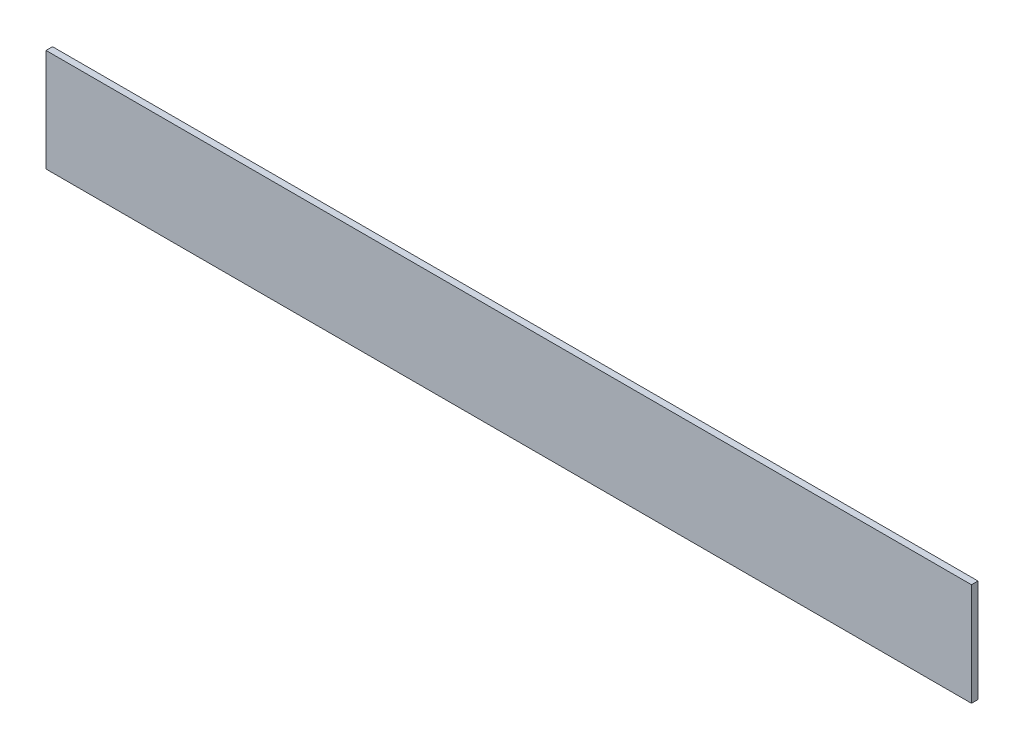
ISO-10303-21;
HEADER;
FILE_DESCRIPTION(('STEP AP214'),'2;1');
FILE_NAME('part.step','',(''),(''),'','','');
FILE_SCHEMA(('AUTOMOTIVE_DESIGN { 1 0 10303 214 1 1 1 1 }'));
ENDSEC;
DATA;
#1=APPLICATION_CONTEXT('core data for automotive mechanical design processes');
#2=APPLICATION_PROTOCOL_DEFINITION('international standard','automotive_design',2000,#1);
#3=PRODUCT_CONTEXT('',#1,'mechanical');
#4=PRODUCT('Part','Part','',(#3));
#5=PRODUCT_RELATED_PRODUCT_CATEGORY('part','',(#4));
#6=PRODUCT_DEFINITION_FORMATION('','',#4);
#7=PRODUCT_DEFINITION_CONTEXT('part definition',#1,'design');
#8=PRODUCT_DEFINITION('design','',#6,#7);
#9=PRODUCT_DEFINITION_SHAPE('','',#8);
#10=(LENGTH_UNIT() NAMED_UNIT(*) SI_UNIT(.MILLI.,.METRE.));
#11=(NAMED_UNIT(*) PLANE_ANGLE_UNIT() SI_UNIT($,.RADIAN.));
#12=(NAMED_UNIT(*) SI_UNIT($,.STERADIAN.) SOLID_ANGLE_UNIT());
#13=UNCERTAINTY_MEASURE_WITH_UNIT(LENGTH_MEASURE(1.E-05),#10,'distance_accuracy_value','');
#14=(GEOMETRIC_REPRESENTATION_CONTEXT(3) GLOBAL_UNCERTAINTY_ASSIGNED_CONTEXT((#13)) GLOBAL_UNIT_ASSIGNED_CONTEXT((#10,
#11,#12)) REPRESENTATION_CONTEXT('',''));
#15=CARTESIAN_POINT('',(0.,0.,0.));
#16=DIRECTION('',(0.,0.,1.));
#17=DIRECTION('',(1.,0.,0.));
#18=AXIS2_PLACEMENT_3D('',#15,#16,#17);
#19=CARTESIAN_POINT('',(225.435,-25.019,3.175));
#20=DIRECTION('',(-1.,0.,0.));
#21=DIRECTION('',(0.,0.,1.));
#22=AXIS2_PLACEMENT_3D('',#19,#20,#21);
#23=PLANE('',#22);
#24=DIRECTION('',(0.,1.,0.));
#25=VECTOR('',#24,1.);
#26=CARTESIAN_POINT('',(225.435,-25.019,0.));
#27=LINE('',#26,#25);
#28=CARTESIAN_POINT('',(225.435,-25.019,0.));
#29=VERTEX_POINT('',#28);
#30=CARTESIAN_POINT('',(225.435,25.019,0.));
#31=VERTEX_POINT('',#30);
#32=EDGE_CURVE('E104',#29,#31,#27,.T.);
#33=ORIENTED_EDGE('',*,*,#32,.T.);
#34=DIRECTION('',(0.,0.,-1.));
#35=VECTOR('',#34,1.);
#36=CARTESIAN_POINT('',(225.435,25.019,3.175));
#37=LINE('',#36,#35);
#38=CARTESIAN_POINT('',(225.435,25.019,3.175));
#39=VERTEX_POINT('',#38);
#40=EDGE_CURVE('E11',#39,#31,#37,.T.);
#41=ORIENTED_EDGE('',*,*,#40,.F.);
#42=DIRECTION('',(0.,1.,0.));
#43=VECTOR('',#42,1.);
#44=CARTESIAN_POINT('',(225.435,-25.019,3.175));
#45=LINE('',#44,#43);
#46=CARTESIAN_POINT('',(225.435,-25.019,3.175));
#47=VERTEX_POINT('',#46);
#48=EDGE_CURVE('E92',#47,#39,#45,.T.);
#49=ORIENTED_EDGE('',*,*,#48,.F.);
#50=DIRECTION('',(0.,0.,-1.));
#51=VECTOR('',#50,1.);
#52=CARTESIAN_POINT('',(225.435,-25.019,3.175));
#53=LINE('',#52,#51);
#54=EDGE_CURVE('E100',#47,#29,#53,.T.);
#55=ORIENTED_EDGE('',*,*,#54,.T.);
#56=EDGE_LOOP('',(#33,#41,#49,#55));
#57=FACE_BOUND('',#56,.T.);
#58=ADVANCED_FACE('F41',(#57),#23,.F.);
#59=CARTESIAN_POINT('',(-225.435,25.019,3.175));
#60=DIRECTION('',(0.,-1.,0.));
#61=DIRECTION('',(0.,0.,-1.));
#62=AXIS2_PLACEMENT_3D('',#59,#60,#61);
#63=PLANE('',#62);
#64=DIRECTION('',(-1.,0.,0.));
#65=VECTOR('',#64,1.);
#66=CARTESIAN_POINT('',(-225.435,25.019,0.));
#67=LINE('',#66,#65);
#68=CARTESIAN_POINT('',(-225.435,25.019,0.));
#69=VERTEX_POINT('',#68);
#70=EDGE_CURVE('E96',#31,#69,#67,.T.);
#71=ORIENTED_EDGE('',*,*,#70,.T.);
#72=DIRECTION('',(0.,0.,-1.));
#73=VECTOR('',#72,1.);
#74=CARTESIAN_POINT('',(-225.435,25.019,3.175));
#75=LINE('',#74,#73);
#76=CARTESIAN_POINT('',(-225.435,25.019,3.175));
#77=VERTEX_POINT('',#76);
#78=EDGE_CURVE('E49',#77,#69,#75,.T.);
#79=ORIENTED_EDGE('',*,*,#78,.F.);
#80=DIRECTION('',(-1.,0.,0.));
#81=VECTOR('',#80,1.);
#82=CARTESIAN_POINT('',(-225.435,25.019,3.175));
#83=LINE('',#82,#81);
#84=EDGE_CURVE('E87',#39,#77,#83,.T.);
#85=ORIENTED_EDGE('',*,*,#84,.F.);
#86=ORIENTED_EDGE('',*,*,#40,.T.);
#87=EDGE_LOOP('',(#71,#79,#85,#86));
#88=FACE_BOUND('',#87,.T.);
#89=ADVANCED_FACE('F95',(#88),#63,.F.);
#90=CARTESIAN_POINT('',(-225.435,-25.019,3.175));
#91=DIRECTION('',(1.,0.,0.));
#92=DIRECTION('',(0.,0.,-1.));
#93=AXIS2_PLACEMENT_3D('',#90,#91,#92);
#94=PLANE('',#93);
#95=DIRECTION('',(0.,-1.,0.));
#96=VECTOR('',#95,1.);
#97=CARTESIAN_POINT('',(-225.435,-25.019,0.));
#98=LINE('',#97,#96);
#99=CARTESIAN_POINT('',(-225.435,-25.019,0.));
#100=VERTEX_POINT('',#99);
#101=EDGE_CURVE('E74',#69,#100,#98,.T.);
#102=ORIENTED_EDGE('',*,*,#101,.T.);
#103=DIRECTION('',(0.,0.,-1.));
#104=VECTOR('',#103,1.);
#105=CARTESIAN_POINT('',(-225.435,-25.019,3.175));
#106=LINE('',#105,#104);
#107=CARTESIAN_POINT('',(-225.435,-25.019,3.175));
#108=VERTEX_POINT('',#107);
#109=EDGE_CURVE('E97',#108,#100,#106,.T.);
#110=ORIENTED_EDGE('',*,*,#109,.F.);
#111=DIRECTION('',(0.,-1.,0.));
#112=VECTOR('',#111,1.);
#113=CARTESIAN_POINT('',(-225.435,-25.019,3.175));
#114=LINE('',#113,#112);
#115=EDGE_CURVE('E90',#77,#108,#114,.T.);
#116=ORIENTED_EDGE('',*,*,#115,.F.);
#117=ORIENTED_EDGE('',*,*,#78,.T.);
#118=EDGE_LOOP('',(#102,#110,#116,#117));
#119=FACE_BOUND('',#118,.T.);
#120=ADVANCED_FACE('F98',(#119),#94,.F.);
#121=CARTESIAN_POINT('',(-225.435,-25.019,3.175));
#122=DIRECTION('',(0.,1.,0.));
#123=DIRECTION('',(0.,0.,1.));
#124=AXIS2_PLACEMENT_3D('',#121,#122,#123);
#125=PLANE('',#124);
#126=DIRECTION('',(1.,0.,0.));
#127=VECTOR('',#126,1.);
#128=CARTESIAN_POINT('',(-225.435,-25.019,0.));
#129=LINE('',#128,#127);
#130=EDGE_CURVE('E80',#100,#29,#129,.T.);
#131=ORIENTED_EDGE('',*,*,#130,.T.);
#132=ORIENTED_EDGE('',*,*,#54,.F.);
#133=DIRECTION('',(1.,0.,0.));
#134=VECTOR('',#133,1.);
#135=CARTESIAN_POINT('',(-225.435,-25.019,3.175));
#136=LINE('',#135,#134);
#137=EDGE_CURVE('E57',#108,#47,#136,.T.);
#138=ORIENTED_EDGE('',*,*,#137,.F.);
#139=ORIENTED_EDGE('',*,*,#109,.T.);
#140=EDGE_LOOP('',(#131,#132,#138,#139));
#141=FACE_BOUND('',#140,.T.);
#142=ADVANCED_FACE('F111',(#141),#125,.F.);
#143=CARTESIAN_POINT('',(0.,0.,3.175));
#144=DIRECTION('',(0.,0.,-1.));
#145=DIRECTION('',(-1.,0.,0.));
#146=AXIS2_PLACEMENT_3D('',#143,#144,#145);
#147=PLANE('',#146);
#148=ORIENTED_EDGE('',*,*,#48,.T.);
#149=ORIENTED_EDGE('',*,*,#84,.T.);
#150=ORIENTED_EDGE('',*,*,#115,.T.);
#151=ORIENTED_EDGE('',*,*,#137,.T.);
#152=EDGE_LOOP('',(#148,#149,#150,#151));
#153=FACE_BOUND('',#152,.T.);
#154=ADVANCED_FACE('F88',(#153),#147,.F.);
#155=CARTESIAN_POINT('',(0.,0.,0.));
#156=DIRECTION('',(0.,0.,-1.));
#157=DIRECTION('',(-1.,0.,0.));
#158=AXIS2_PLACEMENT_3D('',#155,#156,#157);
#159=PLANE('',#158);
#160=ORIENTED_EDGE('',*,*,#32,.F.);
#161=ORIENTED_EDGE('',*,*,#130,.F.);
#162=ORIENTED_EDGE('',*,*,#101,.F.);
#163=ORIENTED_EDGE('',*,*,#70,.F.);
#164=EDGE_LOOP('',(#160,#161,#162,#163));
#165=FACE_BOUND('',#164,.T.);
#166=ADVANCED_FACE('F114',(#165),#159,.T.);
#167=CLOSED_SHELL('',(#58,#89,#120,#142,#154,#166));
#168=MANIFOLD_SOLID_BREP('B2',#167);
#169=ADVANCED_BREP_SHAPE_REPRESENTATION('',(#18,#168),#14);
#170=SHAPE_DEFINITION_REPRESENTATION(#9,#169);
ENDSEC;
END-ISO-10303-21;
